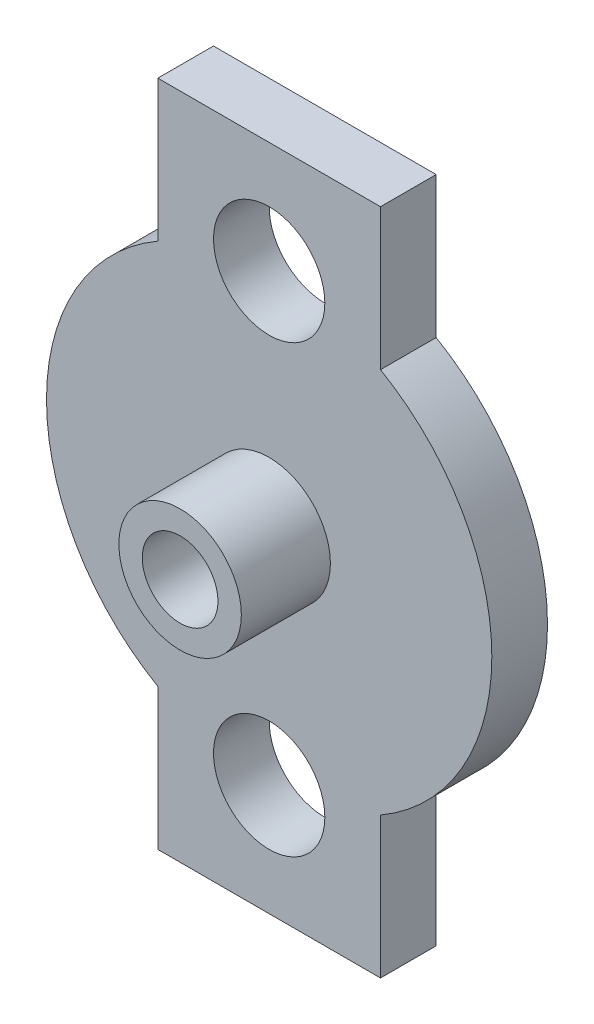
ISO-10303-21;
HEADER;
FILE_DESCRIPTION(('STEP AP214'),'2;1');
FILE_NAME('part.step','',(''),(''),'','','');
FILE_SCHEMA(('AUTOMOTIVE_DESIGN { 1 0 10303 214 1 1 1 1 }'));
ENDSEC;
DATA;
#1=APPLICATION_CONTEXT('core data for automotive mechanical design processes');
#2=APPLICATION_PROTOCOL_DEFINITION('international standard','automotive_design',2000,#1);
#3=PRODUCT_CONTEXT('',#1,'mechanical');
#4=PRODUCT('Part','Part','',(#3));
#5=PRODUCT_RELATED_PRODUCT_CATEGORY('part','',(#4));
#6=PRODUCT_DEFINITION_FORMATION('','',#4);
#7=PRODUCT_DEFINITION_CONTEXT('part definition',#1,'design');
#8=PRODUCT_DEFINITION('design','',#6,#7);
#9=PRODUCT_DEFINITION_SHAPE('','',#8);
#10=(LENGTH_UNIT() NAMED_UNIT(*) SI_UNIT(.MILLI.,.METRE.));
#11=(NAMED_UNIT(*) PLANE_ANGLE_UNIT() SI_UNIT($,.RADIAN.));
#12=(NAMED_UNIT(*) SI_UNIT($,.STERADIAN.) SOLID_ANGLE_UNIT());
#13=UNCERTAINTY_MEASURE_WITH_UNIT(LENGTH_MEASURE(1.E-05),#10,'distance_accuracy_value','');
#14=(GEOMETRIC_REPRESENTATION_CONTEXT(3) GLOBAL_UNCERTAINTY_ASSIGNED_CONTEXT((#13)) GLOBAL_UNIT_ASSIGNED_CONTEXT((#10,
#11,#12)) REPRESENTATION_CONTEXT('',''));
#15=CARTESIAN_POINT('',(0.,0.,0.));
#16=DIRECTION('',(0.,0.,1.));
#17=DIRECTION('',(1.,0.,0.));
#18=AXIS2_PLACEMENT_3D('',#15,#16,#17);
#19=CARTESIAN_POINT('',(0.,0.,2.5));
#20=DIRECTION('',(0.,0.,-1.));
#21=DIRECTION('',(-1.,0.,0.));
#22=AXIS2_PLACEMENT_3D('',#19,#20,#21);
#23=CYLINDRICAL_SURFACE('',#22,10.);
#24=CARTESIAN_POINT('',(0.,0.,2.5));
#25=DIRECTION('',(0.,0.,1.));
#26=DIRECTION('',(1.,0.,0.));
#27=AXIS2_PLACEMENT_3D('',#24,#25,#26);
#28=CIRCLE('',#27,10.);
#29=CARTESIAN_POINT('',(-5.,8.66025403784439,2.5));
#30=VERTEX_POINT('',#29);
#31=CARTESIAN_POINT('',(-5.,-8.66025403784439,2.5));
#32=VERTEX_POINT('',#31);
#33=EDGE_CURVE('E44',#30,#32,#28,.T.);
#34=ORIENTED_EDGE('',*,*,#33,.F.);
#35=DIRECTION('',(0.,0.,1.));
#36=VECTOR('',#35,1.);
#37=CARTESIAN_POINT('',(-5.,8.66025403784439,0.));
#38=LINE('',#37,#36);
#39=CARTESIAN_POINT('',(-5.,8.66025403784439,0.));
#40=VERTEX_POINT('',#39);
#41=EDGE_CURVE('E134',#40,#30,#38,.T.);
#42=ORIENTED_EDGE('',*,*,#41,.F.);
#43=CARTESIAN_POINT('',(0.,0.,0.));
#44=DIRECTION('',(0.,0.,1.));
#45=DIRECTION('',(1.,0.,0.));
#46=AXIS2_PLACEMENT_3D('',#43,#44,#45);
#47=CIRCLE('',#46,10.);
#48=CARTESIAN_POINT('',(-5.,-8.66025403784439,0.));
#49=VERTEX_POINT('',#48);
#50=EDGE_CURVE('E181',#40,#49,#47,.T.);
#51=ORIENTED_EDGE('',*,*,#50,.T.);
#52=DIRECTION('',(0.,0.,1.));
#53=VECTOR('',#52,1.);
#54=CARTESIAN_POINT('',(-5.,-8.66025403784439,0.));
#55=LINE('',#54,#53);
#56=EDGE_CURVE('E149',#49,#32,#55,.T.);
#57=ORIENTED_EDGE('',*,*,#56,.T.);
#58=EDGE_LOOP('',(#34,#42,#51,#57));
#59=FACE_BOUND('',#58,.T.);
#60=ADVANCED_FACE('F35',(#59),#23,.T.);
#61=CARTESIAN_POINT('',(0.,0.,-0.5));
#62=DIRECTION('',(0.,0.,1.));
#63=DIRECTION('',(1.,0.,0.));
#64=AXIS2_PLACEMENT_3D('',#61,#62,#63);
#65=CYLINDRICAL_SURFACE('',#64,0.8);
#66=CARTESIAN_POINT('',(0.,0.,0.));
#67=DIRECTION('',(0.,0.,1.));
#68=DIRECTION('',(1.,0.,0.));
#69=AXIS2_PLACEMENT_3D('',#66,#67,#68);
#70=CIRCLE('',#69,0.8);
#71=CARTESIAN_POINT('',(0.8,0.,0.));
#72=VERTEX_POINT('',#71);
#73=EDGE_CURVE('E176',#72,#72,#70,.T.);
#74=ORIENTED_EDGE('',*,*,#73,.F.);
#75=EDGE_LOOP('',(#74));
#76=FACE_BOUND('',#75,.T.);
#77=CARTESIAN_POINT('',(0.,0.,1.5));
#78=DIRECTION('',(0.,0.,1.));
#79=DIRECTION('',(1.,0.,0.));
#80=AXIS2_PLACEMENT_3D('',#77,#78,#79);
#81=CIRCLE('',#80,0.8);
#82=CARTESIAN_POINT('',(0.8,0.,1.5));
#83=VERTEX_POINT('',#82);
#84=EDGE_CURVE('E168',#83,#83,#81,.F.);
#85=ORIENTED_EDGE('',*,*,#84,.F.);
#86=EDGE_LOOP('',(#85));
#87=FACE_BOUND('',#86,.T.);
#88=ADVANCED_FACE('F234',(#76,#87),#65,.F.);
#89=CARTESIAN_POINT('',(5.,-8.66025403784439,0.));
#90=VERTEX_POINT('',#89);
#91=CARTESIAN_POINT('',(5.,8.66025403784439,0.));
#92=VERTEX_POINT('',#91);
#93=EDGE_CURVE('E179',#90,#92,#47,.T.);
#94=ORIENTED_EDGE('',*,*,#93,.T.);
#95=DIRECTION('',(0.,0.,1.));
#96=VECTOR('',#95,1.);
#97=CARTESIAN_POINT('',(5.,8.66025403784439,0.));
#98=LINE('',#97,#96);
#99=CARTESIAN_POINT('',(5.,8.66025403784439,2.5));
#100=VERTEX_POINT('',#99);
#101=EDGE_CURVE('E59',#92,#100,#98,.T.);
#102=ORIENTED_EDGE('',*,*,#101,.T.);
#103=CARTESIAN_POINT('',(5.,-8.66025403784439,2.5));
#104=VERTEX_POINT('',#103);
#105=EDGE_CURVE('E11',#104,#100,#28,.T.);
#106=ORIENTED_EDGE('',*,*,#105,.F.);
#107=DIRECTION('',(0.,0.,1.));
#108=VECTOR('',#107,1.);
#109=CARTESIAN_POINT('',(5.,-8.66025403784439,0.));
#110=LINE('',#109,#108);
#111=EDGE_CURVE('E157',#90,#104,#110,.T.);
#112=ORIENTED_EDGE('',*,*,#111,.F.);
#113=EDGE_LOOP('',(#94,#102,#106,#112));
#114=FACE_BOUND('',#113,.T.);
#115=ADVANCED_FACE('F37',(#114),#23,.T.);
#116=CARTESIAN_POINT('',(0.,0.,2.5));
#117=DIRECTION('',(0.,0.,1.));
#118=DIRECTION('',(1.,0.,0.));
#119=AXIS2_PLACEMENT_3D('',#116,#117,#118);
#120=PLANE('',#119);
#121=CARTESIAN_POINT('',(0.,-10.,2.5));
#122=DIRECTION('',(0.,0.,1.));
#123=DIRECTION('',(1.,0.,0.));
#124=AXIS2_PLACEMENT_3D('',#121,#122,#123);
#125=CIRCLE('',#124,2.5);
#126=CARTESIAN_POINT('',(2.5,-10.,2.5));
#127=VERTEX_POINT('',#126);
#128=EDGE_CURVE('E187',#127,#127,#125,.T.);
#129=ORIENTED_EDGE('',*,*,#128,.F.);
#130=EDGE_LOOP('',(#129));
#131=FACE_BOUND('',#130,.T.);
#132=CARTESIAN_POINT('',(0.,10.,2.5));
#133=DIRECTION('',(0.,0.,1.));
#134=DIRECTION('',(-1.,0.,0.));
#135=AXIS2_PLACEMENT_3D('',#132,#133,#134);
#136=CIRCLE('',#135,2.5);
#137=CARTESIAN_POINT('',(-2.5,10.,2.5));
#138=VERTEX_POINT('',#137);
#139=EDGE_CURVE('E127',#138,#138,#136,.T.);
#140=ORIENTED_EDGE('',*,*,#139,.F.);
#141=EDGE_LOOP('',(#140));
#142=FACE_BOUND('',#141,.T.);
#143=CARTESIAN_POINT('',(0.,0.,2.5));
#144=DIRECTION('',(0.,0.,1.));
#145=DIRECTION('',(1.,0.,0.));
#146=AXIS2_PLACEMENT_3D('',#143,#144,#145);
#147=CIRCLE('',#146,2.75);
#148=CARTESIAN_POINT('',(2.75,0.,2.5));
#149=VERTEX_POINT('',#148);
#150=EDGE_CURVE('E172',#149,#149,#147,.T.);
#151=ORIENTED_EDGE('',*,*,#150,.F.);
#152=EDGE_LOOP('',(#151));
#153=FACE_BOUND('',#152,.T.);
#154=ORIENTED_EDGE('',*,*,#105,.T.);
#155=DIRECTION('',(0.,1.,0.));
#156=VECTOR('',#155,1.);
#157=CARTESIAN_POINT('',(5.,15.,2.5));
#158=LINE('',#157,#156);
#159=CARTESIAN_POINT('',(5.,15.,2.5));
#160=VERTEX_POINT('',#159);
#161=EDGE_CURVE('E131',#100,#160,#158,.T.);
#162=ORIENTED_EDGE('',*,*,#161,.T.);
#163=DIRECTION('',(-1.,0.,0.));
#164=VECTOR('',#163,1.);
#165=CARTESIAN_POINT('',(-5.,15.,2.5));
#166=LINE('',#165,#164);
#167=CARTESIAN_POINT('',(-5.,15.,2.5));
#168=VERTEX_POINT('',#167);
#169=EDGE_CURVE('E107',#160,#168,#166,.T.);
#170=ORIENTED_EDGE('',*,*,#169,.T.);
#171=DIRECTION('',(0.,-1.,0.));
#172=VECTOR('',#171,1.);
#173=CARTESIAN_POINT('',(-5.,8.66025403784439,2.5));
#174=LINE('',#173,#172);
#175=EDGE_CURVE('E122',#168,#30,#174,.T.);
#176=ORIENTED_EDGE('',*,*,#175,.T.);
#177=ORIENTED_EDGE('',*,*,#33,.T.);
#178=DIRECTION('',(0.,-1.,0.));
#179=VECTOR('',#178,1.);
#180=CARTESIAN_POINT('',(-5.,-8.66025403784439,2.5));
#181=LINE('',#180,#179);
#182=CARTESIAN_POINT('',(-5.,-15.,2.5));
#183=VERTEX_POINT('',#182);
#184=EDGE_CURVE('E136',#32,#183,#181,.T.);
#185=ORIENTED_EDGE('',*,*,#184,.T.);
#186=DIRECTION('',(1.,0.,0.));
#187=VECTOR('',#186,1.);
#188=CARTESIAN_POINT('',(-5.,-15.,2.5));
#189=LINE('',#188,#187);
#190=CARTESIAN_POINT('',(5.,-15.,2.5));
#191=VERTEX_POINT('',#190);
#192=EDGE_CURVE('E152',#183,#191,#189,.T.);
#193=ORIENTED_EDGE('',*,*,#192,.T.);
#194=DIRECTION('',(0.,1.,0.));
#195=VECTOR('',#194,1.);
#196=CARTESIAN_POINT('',(5.,-15.,2.5));
#197=LINE('',#196,#195);
#198=EDGE_CURVE('E143',#191,#104,#197,.T.);
#199=ORIENTED_EDGE('',*,*,#198,.T.);
#200=EDGE_LOOP('',(#154,#162,#170,#176,#177,#185,#193,#199));
#201=FACE_BOUND('',#200,.T.);
#202=ADVANCED_FACE('F200',(#131,#142,#153,#201),#120,.T.);
#203=CARTESIAN_POINT('',(0.,0.,0.));
#204=DIRECTION('',(0.,0.,1.));
#205=DIRECTION('',(1.,0.,0.));
#206=AXIS2_PLACEMENT_3D('',#203,#204,#205);
#207=PLANE('',#206);
#208=CARTESIAN_POINT('',(0.,-10.,0.));
#209=DIRECTION('',(0.,0.,1.));
#210=DIRECTION('',(1.,0.,0.));
#211=AXIS2_PLACEMENT_3D('',#208,#209,#210);
#212=CIRCLE('',#211,2.5);
#213=CARTESIAN_POINT('',(2.5,-10.,0.));
#214=VERTEX_POINT('',#213);
#215=EDGE_CURVE('E39',#214,#214,#212,.T.);
#216=ORIENTED_EDGE('',*,*,#215,.T.);
#217=EDGE_LOOP('',(#216));
#218=FACE_BOUND('',#217,.T.);
#219=CARTESIAN_POINT('',(0.,10.,0.));
#220=DIRECTION('',(0.,0.,1.));
#221=DIRECTION('',(1.,0.,0.));
#222=AXIS2_PLACEMENT_3D('',#219,#220,#221);
#223=CIRCLE('',#222,2.5);
#224=CARTESIAN_POINT('',(2.5,10.,0.));
#225=VERTEX_POINT('',#224);
#226=EDGE_CURVE('E185',#225,#225,#223,.T.);
#227=ORIENTED_EDGE('',*,*,#226,.T.);
#228=EDGE_LOOP('',(#227));
#229=FACE_BOUND('',#228,.T.);
#230=ORIENTED_EDGE('',*,*,#73,.T.);
#231=EDGE_LOOP('',(#230));
#232=FACE_BOUND('',#231,.T.);
#233=ORIENTED_EDGE('',*,*,#93,.F.);
#234=DIRECTION('',(0.,1.,0.));
#235=VECTOR('',#234,1.);
#236=CARTESIAN_POINT('',(5.,-15.,0.));
#237=LINE('',#236,#235);
#238=CARTESIAN_POINT('',(5.,-15.,0.));
#239=VERTEX_POINT('',#238);
#240=EDGE_CURVE('E146',#239,#90,#237,.T.);
#241=ORIENTED_EDGE('',*,*,#240,.F.);
#242=DIRECTION('',(1.,0.,0.));
#243=VECTOR('',#242,1.);
#244=CARTESIAN_POINT('',(-5.,-15.,0.));
#245=LINE('',#244,#243);
#246=CARTESIAN_POINT('',(-5.,-15.,0.));
#247=VERTEX_POINT('',#246);
#248=EDGE_CURVE('E142',#247,#239,#245,.T.);
#249=ORIENTED_EDGE('',*,*,#248,.F.);
#250=DIRECTION('',(0.,-1.,0.));
#251=VECTOR('',#250,1.);
#252=CARTESIAN_POINT('',(-5.,-8.66025403784439,0.));
#253=LINE('',#252,#251);
#254=EDGE_CURVE('E139',#49,#247,#253,.T.);
#255=ORIENTED_EDGE('',*,*,#254,.F.);
#256=ORIENTED_EDGE('',*,*,#50,.F.);
#257=DIRECTION('',(0.,-1.,0.));
#258=VECTOR('',#257,1.);
#259=CARTESIAN_POINT('',(-5.,8.66025403784439,0.));
#260=LINE('',#259,#258);
#261=CARTESIAN_POINT('',(-5.,15.,0.));
#262=VERTEX_POINT('',#261);
#263=EDGE_CURVE('E119',#262,#40,#260,.T.);
#264=ORIENTED_EDGE('',*,*,#263,.F.);
#265=DIRECTION('',(-1.,0.,0.));
#266=VECTOR('',#265,1.);
#267=CARTESIAN_POINT('',(-5.,15.,0.));
#268=LINE('',#267,#266);
#269=CARTESIAN_POINT('',(5.,15.,0.));
#270=VERTEX_POINT('',#269);
#271=EDGE_CURVE('E104',#270,#262,#268,.T.);
#272=ORIENTED_EDGE('',*,*,#271,.F.);
#273=DIRECTION('',(0.,1.,0.));
#274=VECTOR('',#273,1.);
#275=CARTESIAN_POINT('',(5.,15.,0.));
#276=LINE('',#275,#274);
#277=EDGE_CURVE('E117',#92,#270,#276,.T.);
#278=ORIENTED_EDGE('',*,*,#277,.F.);
#279=EDGE_LOOP('',(#233,#241,#249,#255,#256,#264,#272,#278));
#280=FACE_BOUND('',#279,.T.);
#281=ADVANCED_FACE('F116',(#218,#229,#232,#280),#207,.F.);
#282=CARTESIAN_POINT('',(0.,0.,6.5));
#283=DIRECTION('',(0.,0.,1.));
#284=DIRECTION('',(1.,0.,0.));
#285=AXIS2_PLACEMENT_3D('',#282,#283,#284);
#286=PLANE('',#285);
#287=CARTESIAN_POINT('',(0.,0.,6.5));
#288=DIRECTION('',(0.,0.,1.));
#289=DIRECTION('',(1.,0.,0.));
#290=AXIS2_PLACEMENT_3D('',#287,#288,#289);
#291=CIRCLE('',#290,2.75);
#292=CARTESIAN_POINT('',(2.75,0.,6.5));
#293=VERTEX_POINT('',#292);
#294=EDGE_CURVE('E173',#293,#293,#291,.T.);
#295=ORIENTED_EDGE('',*,*,#294,.T.);
#296=EDGE_LOOP('',(#295));
#297=FACE_BOUND('',#296,.T.);
#298=CARTESIAN_POINT('',(0.,0.,6.5));
#299=DIRECTION('',(0.,0.,1.));
#300=DIRECTION('',(1.,0.,0.));
#301=AXIS2_PLACEMENT_3D('',#298,#299,#300);
#302=CIRCLE('',#301,1.7);
#303=CARTESIAN_POINT('',(1.7,0.,6.5));
#304=VERTEX_POINT('',#303);
#305=EDGE_CURVE('E169',#304,#304,#302,.T.);
#306=ORIENTED_EDGE('',*,*,#305,.F.);
#307=EDGE_LOOP('',(#306));
#308=FACE_BOUND('',#307,.T.);
#309=ADVANCED_FACE('F257',(#297,#308),#286,.T.);
#310=CARTESIAN_POINT('',(0.,0.,6.5));
#311=DIRECTION('',(0.,0.,-1.));
#312=DIRECTION('',(-1.,0.,0.));
#313=AXIS2_PLACEMENT_3D('',#310,#311,#312);
#314=CYLINDRICAL_SURFACE('',#313,2.75);
#315=ORIENTED_EDGE('',*,*,#294,.F.);
#316=EDGE_LOOP('',(#315));
#317=FACE_BOUND('',#316,.T.);
#318=ORIENTED_EDGE('',*,*,#150,.T.);
#319=EDGE_LOOP('',(#318));
#320=FACE_BOUND('',#319,.T.);
#321=ADVANCED_FACE('F265',(#317,#320),#314,.T.);
#322=CARTESIAN_POINT('',(0.,0.,6.5));
#323=DIRECTION('',(0.,0.,-1.));
#324=DIRECTION('',(-1.,0.,0.));
#325=AXIS2_PLACEMENT_3D('',#322,#323,#324);
#326=CYLINDRICAL_SURFACE('',#325,1.7);
#327=ORIENTED_EDGE('',*,*,#305,.T.);
#328=EDGE_LOOP('',(#327));
#329=FACE_BOUND('',#328,.T.);
#330=CARTESIAN_POINT('',(0.,0.,1.5));
#331=DIRECTION('',(0.,0.,1.));
#332=DIRECTION('',(1.,0.,0.));
#333=AXIS2_PLACEMENT_3D('',#330,#331,#332);
#334=CIRCLE('',#333,1.7);
#335=CARTESIAN_POINT('',(1.7,0.,1.5));
#336=VERTEX_POINT('',#335);
#337=EDGE_CURVE('E160',#336,#336,#334,.T.);
#338=ORIENTED_EDGE('',*,*,#337,.F.);
#339=EDGE_LOOP('',(#338));
#340=FACE_BOUND('',#339,.T.);
#341=ADVANCED_FACE('F273',(#329,#340),#326,.F.);
#342=CARTESIAN_POINT('',(0.,0.,1.5));
#343=DIRECTION('',(0.,0.,1.));
#344=DIRECTION('',(1.,0.,0.));
#345=AXIS2_PLACEMENT_3D('',#342,#343,#344);
#346=PLANE('',#345);
#347=ORIENTED_EDGE('',*,*,#337,.T.);
#348=EDGE_LOOP('',(#347));
#349=FACE_BOUND('',#348,.T.);
#350=ORIENTED_EDGE('',*,*,#84,.T.);
#351=EDGE_LOOP('',(#350));
#352=FACE_BOUND('',#351,.T.);
#353=ADVANCED_FACE('F231',(#349,#352),#346,.T.);
#354=CARTESIAN_POINT('',(5.,-15.,0.));
#355=DIRECTION('',(1.,0.,0.));
#356=DIRECTION('',(0.,0.,-1.));
#357=AXIS2_PLACEMENT_3D('',#354,#355,#356);
#358=PLANE('',#357);
#359=ORIENTED_EDGE('',*,*,#198,.F.);
#360=DIRECTION('',(0.,0.,1.));
#361=VECTOR('',#360,1.);
#362=CARTESIAN_POINT('',(5.,-15.,0.));
#363=LINE('',#362,#361);
#364=EDGE_CURVE('E161',#239,#191,#363,.T.);
#365=ORIENTED_EDGE('',*,*,#364,.F.);
#366=ORIENTED_EDGE('',*,*,#240,.T.);
#367=ORIENTED_EDGE('',*,*,#111,.T.);
#368=EDGE_LOOP('',(#359,#365,#366,#367));
#369=FACE_BOUND('',#368,.T.);
#370=ADVANCED_FACE('F210',(#369),#358,.T.);
#371=CARTESIAN_POINT('',(-5.,-15.,0.));
#372=DIRECTION('',(0.,-1.,0.));
#373=DIRECTION('',(0.,0.,-1.));
#374=AXIS2_PLACEMENT_3D('',#371,#372,#373);
#375=PLANE('',#374);
#376=ORIENTED_EDGE('',*,*,#192,.F.);
#377=DIRECTION('',(0.,0.,1.));
#378=VECTOR('',#377,1.);
#379=CARTESIAN_POINT('',(-5.,-15.,0.));
#380=LINE('',#379,#378);
#381=EDGE_CURVE('E163',#247,#183,#380,.T.);
#382=ORIENTED_EDGE('',*,*,#381,.F.);
#383=ORIENTED_EDGE('',*,*,#248,.T.);
#384=ORIENTED_EDGE('',*,*,#364,.T.);
#385=EDGE_LOOP('',(#376,#382,#383,#384));
#386=FACE_BOUND('',#385,.T.);
#387=ADVANCED_FACE('F223',(#386),#375,.T.);
#388=CARTESIAN_POINT('',(-5.,-8.66025403784439,0.));
#389=DIRECTION('',(-1.,0.,0.));
#390=DIRECTION('',(0.,-1.,0.));
#391=AXIS2_PLACEMENT_3D('',#388,#389,#390);
#392=PLANE('',#391);
#393=ORIENTED_EDGE('',*,*,#184,.F.);
#394=ORIENTED_EDGE('',*,*,#56,.F.);
#395=ORIENTED_EDGE('',*,*,#254,.T.);
#396=ORIENTED_EDGE('',*,*,#381,.T.);
#397=EDGE_LOOP('',(#393,#394,#395,#396));
#398=FACE_BOUND('',#397,.T.);
#399=ADVANCED_FACE('F218',(#398),#392,.T.);
#400=CARTESIAN_POINT('',(-5.,8.66025403784439,0.));
#401=DIRECTION('',(-1.,0.,0.));
#402=DIRECTION('',(0.,-1.,0.));
#403=AXIS2_PLACEMENT_3D('',#400,#401,#402);
#404=PLANE('',#403);
#405=ORIENTED_EDGE('',*,*,#175,.F.);
#406=DIRECTION('',(0.,0.,1.));
#407=VECTOR('',#406,1.);
#408=CARTESIAN_POINT('',(-5.,15.,0.));
#409=LINE('',#408,#407);
#410=EDGE_CURVE('E112',#262,#168,#409,.T.);
#411=ORIENTED_EDGE('',*,*,#410,.F.);
#412=ORIENTED_EDGE('',*,*,#263,.T.);
#413=ORIENTED_EDGE('',*,*,#41,.T.);
#414=EDGE_LOOP('',(#405,#411,#412,#413));
#415=FACE_BOUND('',#414,.T.);
#416=ADVANCED_FACE('F222',(#415),#404,.T.);
#417=CARTESIAN_POINT('',(-5.,15.,0.));
#418=DIRECTION('',(0.,1.,0.));
#419=DIRECTION('',(0.,0.,1.));
#420=AXIS2_PLACEMENT_3D('',#417,#418,#419);
#421=PLANE('',#420);
#422=ORIENTED_EDGE('',*,*,#169,.F.);
#423=DIRECTION('',(0.,0.,1.));
#424=VECTOR('',#423,1.);
#425=CARTESIAN_POINT('',(5.,15.,0.));
#426=LINE('',#425,#424);
#427=EDGE_CURVE('E101',#270,#160,#426,.T.);
#428=ORIENTED_EDGE('',*,*,#427,.F.);
#429=ORIENTED_EDGE('',*,*,#271,.T.);
#430=ORIENTED_EDGE('',*,*,#410,.T.);
#431=EDGE_LOOP('',(#422,#428,#429,#430));
#432=FACE_BOUND('',#431,.T.);
#433=ADVANCED_FACE('F103',(#432),#421,.T.);
#434=CARTESIAN_POINT('',(5.,15.,0.));
#435=DIRECTION('',(1.,0.,0.));
#436=DIRECTION('',(0.,0.,-1.));
#437=AXIS2_PLACEMENT_3D('',#434,#435,#436);
#438=PLANE('',#437);
#439=ORIENTED_EDGE('',*,*,#161,.F.);
#440=ORIENTED_EDGE('',*,*,#101,.F.);
#441=ORIENTED_EDGE('',*,*,#277,.T.);
#442=ORIENTED_EDGE('',*,*,#427,.T.);
#443=EDGE_LOOP('',(#439,#440,#441,#442));
#444=FACE_BOUND('',#443,.T.);
#445=ADVANCED_FACE('F121',(#444),#438,.T.);
#446=CARTESIAN_POINT('',(0.,10.,-0.5));
#447=DIRECTION('',(0.,0.,1.));
#448=DIRECTION('',(1.,0.,0.));
#449=AXIS2_PLACEMENT_3D('',#446,#447,#448);
#450=CYLINDRICAL_SURFACE('',#449,2.5);
#451=ORIENTED_EDGE('',*,*,#139,.T.);
#452=EDGE_LOOP('',(#451));
#453=FACE_BOUND('',#452,.T.);
#454=ORIENTED_EDGE('',*,*,#226,.F.);
#455=EDGE_LOOP('',(#454));
#456=FACE_BOUND('',#455,.T.);
#457=ADVANCED_FACE('F197',(#453,#456),#450,.F.);
#458=CARTESIAN_POINT('',(0.,-10.,-0.5));
#459=DIRECTION('',(0.,0.,1.));
#460=DIRECTION('',(1.,0.,0.));
#461=AXIS2_PLACEMENT_3D('',#458,#459,#460);
#462=CYLINDRICAL_SURFACE('',#461,2.5);
#463=ORIENTED_EDGE('',*,*,#128,.T.);
#464=EDGE_LOOP('',(#463));
#465=FACE_BOUND('',#464,.T.);
#466=ORIENTED_EDGE('',*,*,#215,.F.);
#467=EDGE_LOOP('',(#466));
#468=FACE_BOUND('',#467,.T.);
#469=ADVANCED_FACE('F333',(#465,#468),#462,.F.);
#470=CLOSED_SHELL('',(#60,#88,#115,#202,#281,#309,#321,#341,#353,#370,#387,#399,#416,#433,#445,
#457,#469));
#471=MANIFOLD_SOLID_BREP('B2',#470);
#472=ADVANCED_BREP_SHAPE_REPRESENTATION('',(#18,#471),#14);
#473=SHAPE_DEFINITION_REPRESENTATION(#9,#472);
ENDSEC;
END-ISO-10303-21;
